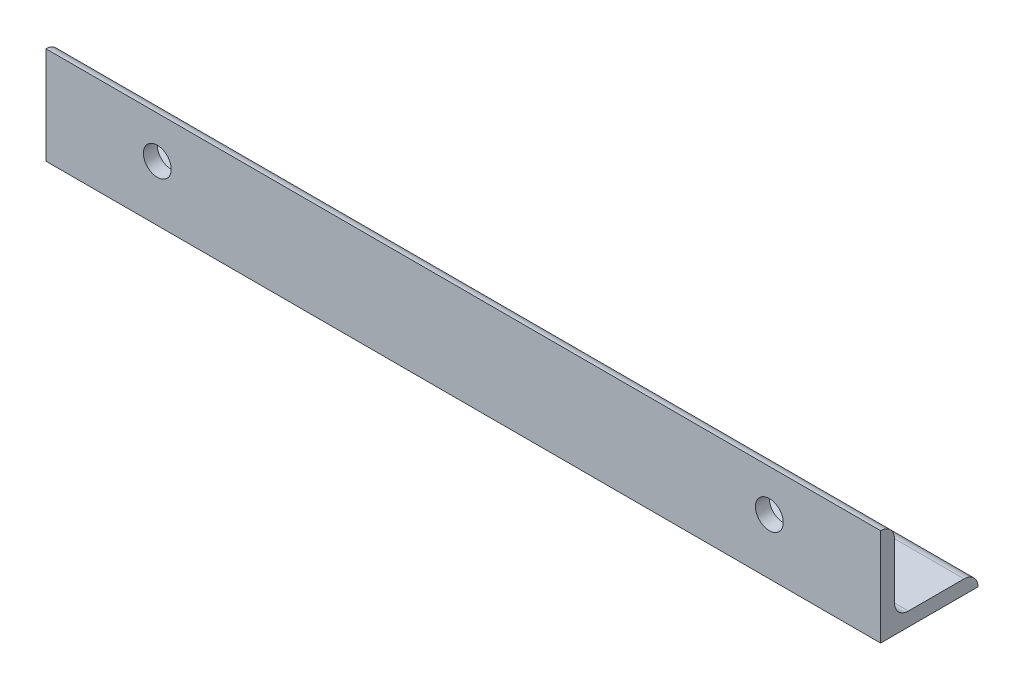
ISO-10303-21;
HEADER;
FILE_DESCRIPTION(('STEP AP214'),'2;1');
FILE_NAME('part.step','',(''),(''),'','','');
FILE_SCHEMA(('AUTOMOTIVE_DESIGN { 1 0 10303 214 1 1 1 1 }'));
ENDSEC;
DATA;
#1=APPLICATION_CONTEXT('core data for automotive mechanical design processes');
#2=APPLICATION_PROTOCOL_DEFINITION('international standard','automotive_design',2000,#1);
#3=PRODUCT_CONTEXT('',#1,'mechanical');
#4=PRODUCT('Part','Part','',(#3));
#5=PRODUCT_RELATED_PRODUCT_CATEGORY('part','',(#4));
#6=PRODUCT_DEFINITION_FORMATION('','',#4);
#7=PRODUCT_DEFINITION_CONTEXT('part definition',#1,'design');
#8=PRODUCT_DEFINITION('design','',#6,#7);
#9=PRODUCT_DEFINITION_SHAPE('','',#8);
#10=(LENGTH_UNIT() NAMED_UNIT(*) SI_UNIT(.MILLI.,.METRE.));
#11=(NAMED_UNIT(*) PLANE_ANGLE_UNIT() SI_UNIT($,.RADIAN.));
#12=(NAMED_UNIT(*) SI_UNIT($,.STERADIAN.) SOLID_ANGLE_UNIT());
#13=UNCERTAINTY_MEASURE_WITH_UNIT(LENGTH_MEASURE(1.E-05),#10,'distance_accuracy_value','');
#14=(GEOMETRIC_REPRESENTATION_CONTEXT(3) GLOBAL_UNCERTAINTY_ASSIGNED_CONTEXT((#13)) GLOBAL_UNIT_ASSIGNED_CONTEXT((#10,
#11,#12)) REPRESENTATION_CONTEXT('',''));
#15=CARTESIAN_POINT('',(0.,0.,0.));
#16=DIRECTION('',(0.,0.,1.));
#17=DIRECTION('',(1.,0.,0.));
#18=AXIS2_PLACEMENT_3D('',#15,#16,#17);
#19=CARTESIAN_POINT('',(300.,0.,-35.));
#20=DIRECTION('',(0.,1.,0.));
#21=DIRECTION('',(0.,0.,1.));
#22=AXIS2_PLACEMENT_3D('',#19,#20,#21);
#23=PLANE('',#22);
#24=DIRECTION('',(0.,0.,-1.));
#25=VECTOR('',#24,1.);
#26=CARTESIAN_POINT('',(0.,0.,-35.));
#27=LINE('',#26,#25);
#28=CARTESIAN_POINT('',(0.,0.,0.));
#29=VERTEX_POINT('',#28);
#30=CARTESIAN_POINT('',(0.,0.,-35.));
#31=VERTEX_POINT('',#30);
#32=EDGE_CURVE('E159',#29,#31,#27,.T.);
#33=ORIENTED_EDGE('',*,*,#32,.T.);
#34=DIRECTION('',(-1.,0.,0.));
#35=VECTOR('',#34,1.);
#36=CARTESIAN_POINT('',(300.,0.,-35.));
#37=LINE('',#36,#35);
#38=CARTESIAN_POINT('',(300.,0.,-35.));
#39=VERTEX_POINT('',#38);
#40=EDGE_CURVE('E13',#39,#31,#37,.T.);
#41=ORIENTED_EDGE('',*,*,#40,.F.);
#42=DIRECTION('',(0.,0.,-1.));
#43=VECTOR('',#42,1.);
#44=CARTESIAN_POINT('',(300.,0.,-35.));
#45=LINE('',#44,#43);
#46=CARTESIAN_POINT('',(300.,0.,0.));
#47=VERTEX_POINT('',#46);
#48=EDGE_CURVE('E179',#47,#39,#45,.T.);
#49=ORIENTED_EDGE('',*,*,#48,.F.);
#50=DIRECTION('',(-1.,0.,0.));
#51=VECTOR('',#50,1.);
#52=CARTESIAN_POINT('',(300.,0.,0.));
#53=LINE('',#52,#51);
#54=EDGE_CURVE('E155',#47,#29,#53,.T.);
#55=ORIENTED_EDGE('',*,*,#54,.T.);
#56=EDGE_LOOP('',(#33,#41,#49,#55));
#57=FACE_BOUND('',#56,.T.);
#58=ADVANCED_FACE('F64',(#57),#23,.F.);
#59=CARTESIAN_POINT('',(300.,0.,-30.));
#60=DIRECTION('',(-1.,0.,0.));
#61=DIRECTION('',(0.,0.,1.));
#62=AXIS2_PLACEMENT_3D('',#59,#60,#61);
#63=CYLINDRICAL_SURFACE('',#62,5.);
#64=CARTESIAN_POINT('',(0.,0.,-30.));
#65=DIRECTION('',(1.,0.,0.));
#66=DIRECTION('',(0.,0.,-1.));
#67=AXIS2_PLACEMENT_3D('',#64,#65,#66);
#68=CIRCLE('',#67,5.);
#69=CARTESIAN_POINT('',(0.,5.,-30.));
#70=VERTEX_POINT('',#69);
#71=EDGE_CURVE('E163',#31,#70,#68,.T.);
#72=ORIENTED_EDGE('',*,*,#71,.T.);
#73=DIRECTION('',(-1.,0.,0.));
#74=VECTOR('',#73,1.);
#75=CARTESIAN_POINT('',(300.,5.,-30.));
#76=LINE('',#75,#74);
#77=CARTESIAN_POINT('',(300.,5.,-30.));
#78=VERTEX_POINT('',#77);
#79=EDGE_CURVE('E73',#78,#70,#76,.T.);
#80=ORIENTED_EDGE('',*,*,#79,.F.);
#81=CARTESIAN_POINT('',(300.,0.,-30.));
#82=DIRECTION('',(1.,0.,0.));
#83=DIRECTION('',(0.,0.,-1.));
#84=AXIS2_PLACEMENT_3D('',#81,#82,#83);
#85=CIRCLE('',#84,5.);
#86=EDGE_CURVE('E121',#39,#78,#85,.T.);
#87=ORIENTED_EDGE('',*,*,#86,.F.);
#88=ORIENTED_EDGE('',*,*,#40,.T.);
#89=EDGE_LOOP('',(#72,#80,#87,#88));
#90=FACE_BOUND('',#89,.T.);
#91=ADVANCED_FACE('F252',(#90),#63,.T.);
#92=CARTESIAN_POINT('',(300.,5.,-10.));
#93=DIRECTION('',(0.,-1.,0.));
#94=DIRECTION('',(0.,0.,-1.));
#95=AXIS2_PLACEMENT_3D('',#92,#93,#94);
#96=PLANE('',#95);
#97=DIRECTION('',(0.,0.,1.));
#98=VECTOR('',#97,1.);
#99=CARTESIAN_POINT('',(0.,5.,-10.));
#100=LINE('',#99,#98);
#101=CARTESIAN_POINT('',(0.,5.,-10.));
#102=VERTEX_POINT('',#101);
#103=EDGE_CURVE('E167',#70,#102,#100,.T.);
#104=ORIENTED_EDGE('',*,*,#103,.T.);
#105=DIRECTION('',(-1.,0.,0.));
#106=VECTOR('',#105,1.);
#107=CARTESIAN_POINT('',(300.,5.,-10.));
#108=LINE('',#107,#106);
#109=CARTESIAN_POINT('',(300.,5.,-10.));
#110=VERTEX_POINT('',#109);
#111=EDGE_CURVE('E186',#110,#102,#108,.T.);
#112=ORIENTED_EDGE('',*,*,#111,.F.);
#113=DIRECTION('',(0.,0.,1.));
#114=VECTOR('',#113,1.);
#115=CARTESIAN_POINT('',(300.,5.,-10.));
#116=LINE('',#115,#114);
#117=EDGE_CURVE('E196',#78,#110,#116,.T.);
#118=ORIENTED_EDGE('',*,*,#117,.F.);
#119=ORIENTED_EDGE('',*,*,#79,.T.);
#120=EDGE_LOOP('',(#104,#112,#118,#119));
#121=FACE_BOUND('',#120,.T.);
#122=ADVANCED_FACE('F194',(#121),#96,.F.);
#123=CARTESIAN_POINT('',(300.,10.,-10.));
#124=DIRECTION('',(-1.,0.,0.));
#125=DIRECTION('',(0.,0.,1.));
#126=AXIS2_PLACEMENT_3D('',#123,#124,#125);
#127=CYLINDRICAL_SURFACE('',#126,5.);
#128=CARTESIAN_POINT('',(0.,10.,-10.));
#129=DIRECTION('',(-1.,0.,0.));
#130=DIRECTION('',(0.,0.,1.));
#131=AXIS2_PLACEMENT_3D('',#128,#129,#130);
#132=CIRCLE('',#131,5.);
#133=CARTESIAN_POINT('',(0.,10.,-5.));
#134=VERTEX_POINT('',#133);
#135=EDGE_CURVE('E170',#102,#134,#132,.T.);
#136=ORIENTED_EDGE('',*,*,#135,.T.);
#137=DIRECTION('',(-1.,0.,0.));
#138=VECTOR('',#137,1.);
#139=CARTESIAN_POINT('',(300.,10.,-5.));
#140=LINE('',#139,#138);
#141=CARTESIAN_POINT('',(300.,10.,-5.));
#142=VERTEX_POINT('',#141);
#143=EDGE_CURVE('E148',#142,#134,#140,.T.);
#144=ORIENTED_EDGE('',*,*,#143,.F.);
#145=CARTESIAN_POINT('',(300.,10.,-10.));
#146=DIRECTION('',(-1.,0.,0.));
#147=DIRECTION('',(0.,0.,1.));
#148=AXIS2_PLACEMENT_3D('',#145,#146,#147);
#149=CIRCLE('',#148,5.);
#150=EDGE_CURVE('E137',#110,#142,#149,.T.);
#151=ORIENTED_EDGE('',*,*,#150,.F.);
#152=ORIENTED_EDGE('',*,*,#111,.T.);
#153=EDGE_LOOP('',(#136,#144,#151,#152));
#154=FACE_BOUND('',#153,.T.);
#155=ADVANCED_FACE('F202',(#154),#127,.F.);
#156=CARTESIAN_POINT('',(300.,30.,-5.));
#157=DIRECTION('',(0.,0.,1.));
#158=DIRECTION('',(0.,-1.,0.));
#159=AXIS2_PLACEMENT_3D('',#156,#157,#158);
#160=PLANE('',#159);
#161=CARTESIAN_POINT('',(260.,20.,-5.));
#162=DIRECTION('',(0.,0.,-1.));
#163=DIRECTION('',(0.,1.,0.));
#164=AXIS2_PLACEMENT_3D('',#161,#162,#163);
#165=CIRCLE('',#164,4.99999999999999);
#166=CARTESIAN_POINT('',(260.,25.,-5.));
#167=VERTEX_POINT('',#166);
#168=EDGE_CURVE('E219',#167,#167,#165,.T.);
#169=ORIENTED_EDGE('',*,*,#168,.F.);
#170=EDGE_LOOP('',(#169));
#171=FACE_BOUND('',#170,.T.);
#172=CARTESIAN_POINT('',(40.,20.,-5.));
#173=DIRECTION('',(0.,0.,-1.));
#174=DIRECTION('',(0.,1.,0.));
#175=AXIS2_PLACEMENT_3D('',#172,#173,#174);
#176=CIRCLE('',#175,5.);
#177=CARTESIAN_POINT('',(40.,25.,-5.));
#178=VERTEX_POINT('',#177);
#179=EDGE_CURVE('E211',#178,#178,#176,.T.);
#180=ORIENTED_EDGE('',*,*,#179,.F.);
#181=EDGE_LOOP('',(#180));
#182=FACE_BOUND('',#181,.T.);
#183=DIRECTION('',(0.,1.,0.));
#184=VECTOR('',#183,1.);
#185=CARTESIAN_POINT('',(0.,30.,-5.));
#186=LINE('',#185,#184);
#187=CARTESIAN_POINT('',(0.,30.,-5.));
#188=VERTEX_POINT('',#187);
#189=EDGE_CURVE('E146',#134,#188,#186,.T.);
#190=ORIENTED_EDGE('',*,*,#189,.T.);
#191=DIRECTION('',(-1.,0.,0.));
#192=VECTOR('',#191,1.);
#193=CARTESIAN_POINT('',(300.,30.,-5.));
#194=LINE('',#193,#192);
#195=CARTESIAN_POINT('',(300.,30.,-5.));
#196=VERTEX_POINT('',#195);
#197=EDGE_CURVE('E143',#196,#188,#194,.T.);
#198=ORIENTED_EDGE('',*,*,#197,.F.);
#199=DIRECTION('',(0.,1.,0.));
#200=VECTOR('',#199,1.);
#201=CARTESIAN_POINT('',(300.,30.,-5.));
#202=LINE('',#201,#200);
#203=EDGE_CURVE('E131',#142,#196,#202,.T.);
#204=ORIENTED_EDGE('',*,*,#203,.F.);
#205=ORIENTED_EDGE('',*,*,#143,.T.);
#206=EDGE_LOOP('',(#190,#198,#204,#205));
#207=FACE_BOUND('',#206,.T.);
#208=ADVANCED_FACE('F144',(#171,#182,#207),#160,.F.);
#209=CARTESIAN_POINT('',(300.,30.,0.));
#210=DIRECTION('',(-1.,0.,0.));
#211=DIRECTION('',(0.,0.,1.));
#212=AXIS2_PLACEMENT_3D('',#209,#210,#211);
#213=CYLINDRICAL_SURFACE('',#212,5.);
#214=CARTESIAN_POINT('',(0.,30.,0.));
#215=DIRECTION('',(1.,0.,0.));
#216=DIRECTION('',(0.,0.,1.));
#217=AXIS2_PLACEMENT_3D('',#214,#215,#216);
#218=CIRCLE('',#217,5.);
#219=CARTESIAN_POINT('',(0.,35.,0.));
#220=VERTEX_POINT('',#219);
#221=EDGE_CURVE('E107',#188,#220,#218,.T.);
#222=ORIENTED_EDGE('',*,*,#221,.T.);
#223=DIRECTION('',(-1.,0.,0.));
#224=VECTOR('',#223,1.);
#225=CARTESIAN_POINT('',(300.,35.,0.));
#226=LINE('',#225,#224);
#227=CARTESIAN_POINT('',(300.,35.,0.));
#228=VERTEX_POINT('',#227);
#229=EDGE_CURVE('E149',#228,#220,#226,.T.);
#230=ORIENTED_EDGE('',*,*,#229,.F.);
#231=CARTESIAN_POINT('',(300.,30.,0.));
#232=DIRECTION('',(1.,0.,0.));
#233=DIRECTION('',(0.,0.,1.));
#234=AXIS2_PLACEMENT_3D('',#231,#232,#233);
#235=CIRCLE('',#234,5.);
#236=EDGE_CURVE('E135',#196,#228,#235,.T.);
#237=ORIENTED_EDGE('',*,*,#236,.F.);
#238=ORIENTED_EDGE('',*,*,#197,.T.);
#239=EDGE_LOOP('',(#222,#230,#237,#238));
#240=FACE_BOUND('',#239,.T.);
#241=ADVANCED_FACE('F151',(#240),#213,.T.);
#242=CARTESIAN_POINT('',(300.,0.,0.));
#243=DIRECTION('',(0.,0.,-1.));
#244=DIRECTION('',(-1.,0.,0.));
#245=AXIS2_PLACEMENT_3D('',#242,#243,#244);
#246=PLANE('',#245);
#247=CARTESIAN_POINT('',(260.,20.,0.));
#248=DIRECTION('',(0.,0.,-1.));
#249=DIRECTION('',(0.,1.,0.));
#250=AXIS2_PLACEMENT_3D('',#247,#248,#249);
#251=CIRCLE('',#250,4.99999999999999);
#252=CARTESIAN_POINT('',(260.,25.,0.));
#253=VERTEX_POINT('',#252);
#254=EDGE_CURVE('E164',#253,#253,#251,.T.);
#255=ORIENTED_EDGE('',*,*,#254,.T.);
#256=EDGE_LOOP('',(#255));
#257=FACE_BOUND('',#256,.T.);
#258=CARTESIAN_POINT('',(40.,20.,0.));
#259=DIRECTION('',(0.,0.,-1.));
#260=DIRECTION('',(0.,1.,0.));
#261=AXIS2_PLACEMENT_3D('',#258,#259,#260);
#262=CIRCLE('',#261,5.);
#263=CARTESIAN_POINT('',(40.,25.,0.));
#264=VERTEX_POINT('',#263);
#265=EDGE_CURVE('E215',#264,#264,#262,.T.);
#266=ORIENTED_EDGE('',*,*,#265,.T.);
#267=EDGE_LOOP('',(#266));
#268=FACE_BOUND('',#267,.T.);
#269=DIRECTION('',(0.,-1.,0.));
#270=VECTOR('',#269,1.);
#271=CARTESIAN_POINT('',(0.,0.,0.));
#272=LINE('',#271,#270);
#273=EDGE_CURVE('E113',#220,#29,#272,.T.);
#274=ORIENTED_EDGE('',*,*,#273,.T.);
#275=ORIENTED_EDGE('',*,*,#54,.F.);
#276=DIRECTION('',(0.,-1.,0.));
#277=VECTOR('',#276,1.);
#278=CARTESIAN_POINT('',(300.,0.,0.));
#279=LINE('',#278,#277);
#280=EDGE_CURVE('E81',#228,#47,#279,.T.);
#281=ORIENTED_EDGE('',*,*,#280,.F.);
#282=ORIENTED_EDGE('',*,*,#229,.T.);
#283=EDGE_LOOP('',(#274,#275,#281,#282));
#284=FACE_BOUND('',#283,.T.);
#285=ADVANCED_FACE('F227',(#257,#268,#284),#246,.F.);
#286=CARTESIAN_POINT('',(300.,30.,0.));
#287=DIRECTION('',(-1.,0.,0.));
#288=DIRECTION('',(0.,0.,1.));
#289=AXIS2_PLACEMENT_3D('',#286,#287,#288);
#290=PLANE('',#289);
#291=ORIENTED_EDGE('',*,*,#48,.T.);
#292=ORIENTED_EDGE('',*,*,#86,.T.);
#293=ORIENTED_EDGE('',*,*,#117,.T.);
#294=ORIENTED_EDGE('',*,*,#150,.T.);
#295=ORIENTED_EDGE('',*,*,#203,.T.);
#296=ORIENTED_EDGE('',*,*,#236,.T.);
#297=ORIENTED_EDGE('',*,*,#280,.T.);
#298=EDGE_LOOP('',(#291,#292,#293,#294,#295,#296,#297));
#299=FACE_BOUND('',#298,.T.);
#300=ADVANCED_FACE('F133',(#299),#290,.F.);
#301=CARTESIAN_POINT('',(0.,30.,0.));
#302=DIRECTION('',(-1.,0.,0.));
#303=DIRECTION('',(0.,0.,1.));
#304=AXIS2_PLACEMENT_3D('',#301,#302,#303);
#305=PLANE('',#304);
#306=ORIENTED_EDGE('',*,*,#32,.F.);
#307=ORIENTED_EDGE('',*,*,#273,.F.);
#308=ORIENTED_EDGE('',*,*,#221,.F.);
#309=ORIENTED_EDGE('',*,*,#189,.F.);
#310=ORIENTED_EDGE('',*,*,#135,.F.);
#311=ORIENTED_EDGE('',*,*,#103,.F.);
#312=ORIENTED_EDGE('',*,*,#71,.F.);
#313=EDGE_LOOP('',(#306,#307,#308,#309,#310,#311,#312));
#314=FACE_BOUND('',#313,.T.);
#315=ADVANCED_FACE('F200',(#314),#305,.T.);
#316=CARTESIAN_POINT('',(40.,20.,0.));
#317=DIRECTION('',(0.,0.,-1.));
#318=DIRECTION('',(0.,1.,0.));
#319=AXIS2_PLACEMENT_3D('',#316,#317,#318);
#320=CYLINDRICAL_SURFACE('',#319,5.);
#321=ORIENTED_EDGE('',*,*,#265,.F.);
#322=EDGE_LOOP('',(#321));
#323=FACE_BOUND('',#322,.T.);
#324=ORIENTED_EDGE('',*,*,#179,.T.);
#325=EDGE_LOOP('',(#324));
#326=FACE_BOUND('',#325,.T.);
#327=ADVANCED_FACE('F233',(#323,#326),#320,.F.);
#328=CARTESIAN_POINT('',(260.,20.,0.));
#329=DIRECTION('',(0.,0.,-1.));
#330=DIRECTION('',(0.,1.,0.));
#331=AXIS2_PLACEMENT_3D('',#328,#329,#330);
#332=CYLINDRICAL_SURFACE('',#331,4.99999999999999);
#333=ORIENTED_EDGE('',*,*,#254,.F.);
#334=EDGE_LOOP('',(#333));
#335=FACE_BOUND('',#334,.T.);
#336=ORIENTED_EDGE('',*,*,#168,.T.);
#337=EDGE_LOOP('',(#336));
#338=FACE_BOUND('',#337,.T.);
#339=ADVANCED_FACE('F230',(#335,#338),#332,.F.);
#340=CLOSED_SHELL('',(#58,#91,#122,#155,#208,#241,#285,#300,#315,#327,#339));
#341=MANIFOLD_SOLID_BREP('B2',#340);
#342=ADVANCED_BREP_SHAPE_REPRESENTATION('',(#18,#341),#14);
#343=SHAPE_DEFINITION_REPRESENTATION(#9,#342);
ENDSEC;
END-ISO-10303-21;
